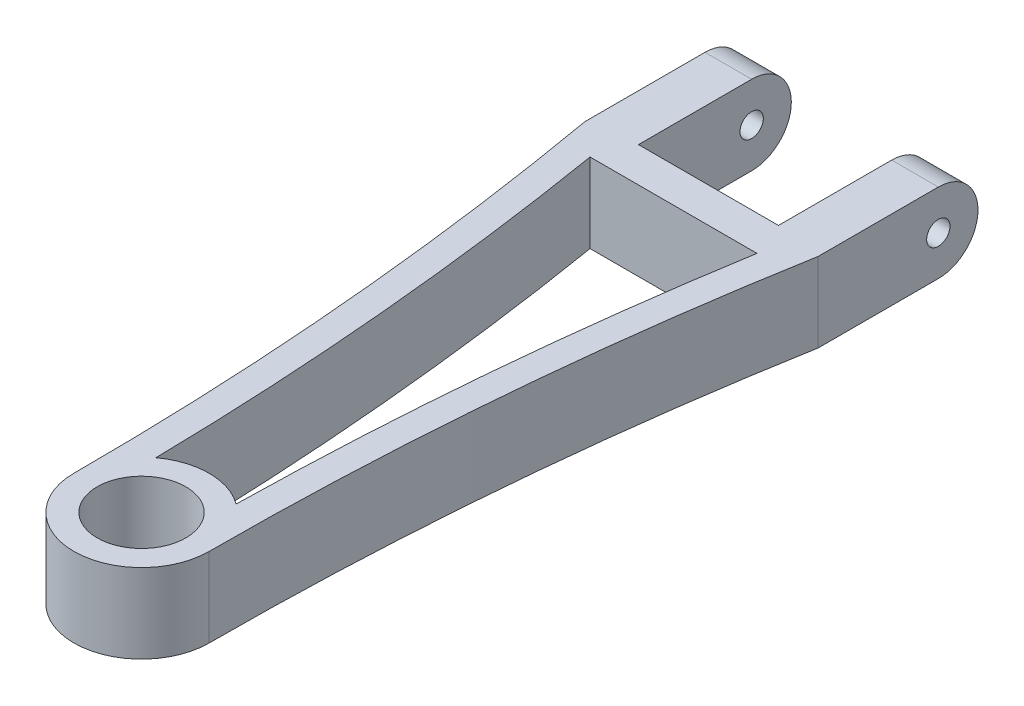
ISO-10303-21;
HEADER;
FILE_DESCRIPTION(('STEP AP214'),'2;1');
FILE_NAME('part.step','',(''),(''),'','','');
FILE_SCHEMA(('AUTOMOTIVE_DESIGN { 1 0 10303 214 1 1 1 1 }'));
ENDSEC;
DATA;
#1=APPLICATION_CONTEXT('core data for automotive mechanical design processes');
#2=APPLICATION_PROTOCOL_DEFINITION('international standard','automotive_design',2000,#1);
#3=PRODUCT_CONTEXT('',#1,'mechanical');
#4=PRODUCT('Part','Part','',(#3));
#5=PRODUCT_RELATED_PRODUCT_CATEGORY('part','',(#4));
#6=PRODUCT_DEFINITION_FORMATION('','',#4);
#7=PRODUCT_DEFINITION_CONTEXT('part definition',#1,'design');
#8=PRODUCT_DEFINITION('design','',#6,#7);
#9=PRODUCT_DEFINITION_SHAPE('','',#8);
#10=(LENGTH_UNIT() NAMED_UNIT(*) SI_UNIT(.MILLI.,.METRE.));
#11=(NAMED_UNIT(*) PLANE_ANGLE_UNIT() SI_UNIT($,.RADIAN.));
#12=(NAMED_UNIT(*) SI_UNIT($,.STERADIAN.) SOLID_ANGLE_UNIT());
#13=UNCERTAINTY_MEASURE_WITH_UNIT(LENGTH_MEASURE(1.E-05),#10,'distance_accuracy_value','');
#14=(GEOMETRIC_REPRESENTATION_CONTEXT(3) GLOBAL_UNCERTAINTY_ASSIGNED_CONTEXT((#13)) GLOBAL_UNIT_ASSIGNED_CONTEXT((#10,
#11,#12)) REPRESENTATION_CONTEXT('',''));
#15=CARTESIAN_POINT('',(0.,0.,0.));
#16=DIRECTION('',(0.,0.,1.));
#17=DIRECTION('',(1.,0.,0.));
#18=AXIS2_PLACEMENT_3D('',#15,#16,#17);
#19=CARTESIAN_POINT('',(895.939642857131,10.795,-1.02001740387436E-12));
#20=DIRECTION('',(0.,1.,0.));
#21=DIRECTION('',(0.,0.,1.));
#22=AXIS2_PLACEMENT_3D('',#19,#20,#21);
#23=PLANE('',#22);
#24=DIRECTION('',(1.,0.,0.));
#25=VECTOR('',#24,1.);
#26=CARTESIAN_POINT('',(-31.75,10.795,-185.094440122762));
#27=LINE('',#26,#25);
#28=CARTESIAN_POINT('',(-31.75,10.795,-185.094440122762));
#29=VERTEX_POINT('',#28);
#30=CARTESIAN_POINT('',(-19.0499999999999,10.795,-185.094440122762));
#31=VERTEX_POINT('',#30);
#32=EDGE_CURVE('E151',#29,#31,#27,.T.);
#33=ORIENTED_EDGE('',*,*,#32,.F.);
#34=DIRECTION('',(0.,0.,1.));
#35=VECTOR('',#34,1.);
#36=CARTESIAN_POINT('',(-31.75,10.795,-203.2));
#37=LINE('',#36,#35);
#38=CARTESIAN_POINT('',(-31.75,10.795,-152.4));
#39=VERTEX_POINT('',#38);
#40=EDGE_CURVE('E174',#29,#39,#37,.T.);
#41=ORIENTED_EDGE('',*,*,#40,.T.);
#42=CARTESIAN_POINT('',(-895.939642857131,10.795,-1.02001740387436E-12));
#43=DIRECTION('',(0.,-1.,0.));
#44=DIRECTION('',(0.,0.,-1.));
#45=AXIS2_PLACEMENT_3D('',#42,#43,#44);
#46=CIRCLE('',#45,877.524642857131);
#47=CARTESIAN_POINT('',(-18.415,10.795,0.));
#48=VERTEX_POINT('',#47);
#49=EDGE_CURVE('E194',#39,#48,#46,.T.);
#50=ORIENTED_EDGE('',*,*,#49,.T.);
#51=CARTESIAN_POINT('',(0.,10.795,0.));
#52=DIRECTION('',(0.,1.,0.));
#53=DIRECTION('',(0.,0.,1.));
#54=AXIS2_PLACEMENT_3D('',#51,#52,#53);
#55=CIRCLE('',#54,18.415);
#56=CARTESIAN_POINT('',(18.415,10.795,0.));
#57=VERTEX_POINT('',#56);
#58=EDGE_CURVE('E219',#48,#57,#55,.T.);
#59=ORIENTED_EDGE('',*,*,#58,.T.);
#60=CARTESIAN_POINT('',(895.939642857131,10.795,-1.02001740387436E-12));
#61=DIRECTION('',(0.,-1.,0.));
#62=DIRECTION('',(0.,0.,1.));
#63=AXIS2_PLACEMENT_3D('',#60,#61,#62);
#64=CIRCLE('',#63,877.524642857131);
#65=CARTESIAN_POINT('',(31.75,10.795,-152.4));
#66=VERTEX_POINT('',#65);
#67=EDGE_CURVE('E167',#57,#66,#64,.T.);
#68=ORIENTED_EDGE('',*,*,#67,.T.);
#69=DIRECTION('',(0.,0.,1.));
#70=VECTOR('',#69,1.);
#71=CARTESIAN_POINT('',(31.75,10.795,-203.2));
#72=LINE('',#71,#70);
#73=CARTESIAN_POINT('',(31.75,10.795,-185.094440122762));
#74=VERTEX_POINT('',#73);
#75=EDGE_CURVE('E158',#74,#66,#72,.T.);
#76=ORIENTED_EDGE('',*,*,#75,.F.);
#77=CARTESIAN_POINT('',(19.05,10.795,-185.094440122762));
#78=VERTEX_POINT('',#77);
#79=EDGE_CURVE('E140',#78,#74,#27,.T.);
#80=ORIENTED_EDGE('',*,*,#79,.F.);
#81=DIRECTION('',(0.,0.,1.));
#82=VECTOR('',#81,1.);
#83=CARTESIAN_POINT('',(19.05,10.795,-203.2));
#84=LINE('',#83,#82);
#85=CARTESIAN_POINT('',(19.05,10.795,-154.288880245525));
#86=VERTEX_POINT('',#85);
#87=EDGE_CURVE('E170',#78,#86,#84,.T.);
#88=ORIENTED_EDGE('',*,*,#87,.T.);
#89=DIRECTION('',(1.,0.,0.));
#90=VECTOR('',#89,1.);
#91=CARTESIAN_POINT('',(-31.751,10.795,-154.288880245525));
#92=LINE('',#91,#90);
#93=CARTESIAN_POINT('',(-19.05,10.795,-154.288880245525));
#94=VERTEX_POINT('',#93);
#95=EDGE_CURVE('E234',#94,#86,#92,.T.);
#96=ORIENTED_EDGE('',*,*,#95,.F.);
#97=DIRECTION('',(0.,0.,1.));
#98=VECTOR('',#97,1.);
#99=CARTESIAN_POINT('',(-19.05,10.795,-203.2));
#100=LINE('',#99,#98);
#101=EDGE_CURVE('E188',#31,#94,#100,.T.);
#102=ORIENTED_EDGE('',*,*,#101,.F.);
#103=EDGE_LOOP('',(#33,#41,#50,#59,#68,#76,#80,#88,#96,#102));
#104=FACE_BOUND('',#103,.T.);
#105=CARTESIAN_POINT('',(0.,10.795,0.));
#106=DIRECTION('',(0.,1.,0.));
#107=DIRECTION('',(0.,0.,1.));
#108=AXIS2_PLACEMENT_3D('',#105,#106,#107);
#109=CIRCLE('',#108,12.065);
#110=CARTESIAN_POINT('',(0.,10.795,12.065));
#111=VERTEX_POINT('',#110);
#112=EDGE_CURVE('E205',#111,#111,#109,.T.);
#113=ORIENTED_EDGE('',*,*,#112,.F.);
#114=EDGE_LOOP('',(#113));
#115=FACE_BOUND('',#114,.T.);
#116=CARTESIAN_POINT('',(0.,10.795,0.));
#117=DIRECTION('',(0.,-1.,0.));
#118=DIRECTION('',(0.,0.,-1.));
#119=AXIS2_PLACEMENT_3D('',#116,#117,#118);
#120=CIRCLE('',#119,18.4150000000032);
#121=CARTESIAN_POINT('',(-10.9192160684454,10.795,-14.8284505411295));
#122=VERTEX_POINT('',#121);
#123=CARTESIAN_POINT('',(10.9192160684454,10.795,-14.8284505411295));
#124=VERTEX_POINT('',#123);
#125=EDGE_CURVE('E282',#122,#124,#120,.T.);
#126=ORIENTED_EDGE('',*,*,#125,.F.);
#127=CARTESIAN_POINT('',(-895.939642857131,10.795,-1.02001740387436E-12));
#128=DIRECTION('',(0.,-1.,0.));
#129=DIRECTION('',(0.,0.,-1.));
#130=AXIS2_PLACEMENT_3D('',#127,#128,#129);
#131=CIRCLE('',#130,885.144642857131);
#132=CARTESIAN_POINT('',(-22.7158511641433,10.795,-144.78));
#133=VERTEX_POINT('',#132);
#134=EDGE_CURVE('E266',#133,#122,#131,.T.);
#135=ORIENTED_EDGE('',*,*,#134,.F.);
#136=DIRECTION('',(1.,0.,0.));
#137=VECTOR('',#136,1.);
#138=CARTESIAN_POINT('',(0.,10.795,-144.78));
#139=LINE('',#138,#137);
#140=CARTESIAN_POINT('',(22.7158511641433,10.795,-144.78));
#141=VERTEX_POINT('',#140);
#142=EDGE_CURVE('E386',#133,#141,#139,.T.);
#143=ORIENTED_EDGE('',*,*,#142,.T.);
#144=CARTESIAN_POINT('',(895.939642857131,10.795,-1.02001740387436E-12));
#145=DIRECTION('',(0.,-1.,0.));
#146=DIRECTION('',(0.,0.,-1.));
#147=AXIS2_PLACEMENT_3D('',#144,#145,#146);
#148=CIRCLE('',#147,885.144642857131);
#149=EDGE_CURVE('E275',#124,#141,#148,.T.);
#150=ORIENTED_EDGE('',*,*,#149,.F.);
#151=EDGE_LOOP('',(#126,#135,#143,#150));
#152=FACE_BOUND('',#151,.T.);
#153=ADVANCED_FACE('F38',(#104,#115,#152),#23,.T.);
#154=CARTESIAN_POINT('',(895.939642857131,-10.795,-1.02001740387436E-12));
#155=DIRECTION('',(0.,1.,0.));
#156=DIRECTION('',(0.,0.,1.));
#157=AXIS2_PLACEMENT_3D('',#154,#155,#156);
#158=PLANE('',#157);
#159=CARTESIAN_POINT('',(0.,-10.795,0.));
#160=DIRECTION('',(0.,1.,0.));
#161=DIRECTION('',(0.,0.,1.));
#162=AXIS2_PLACEMENT_3D('',#159,#160,#161);
#163=CIRCLE('',#162,12.065);
#164=CARTESIAN_POINT('',(0.,-10.795,12.065));
#165=VERTEX_POINT('',#164);
#166=EDGE_CURVE('E218',#165,#165,#163,.T.);
#167=ORIENTED_EDGE('',*,*,#166,.T.);
#168=EDGE_LOOP('',(#167));
#169=FACE_BOUND('',#168,.T.);
#170=DIRECTION('',(0.,0.,1.));
#171=VECTOR('',#170,1.);
#172=CARTESIAN_POINT('',(-31.75,-10.795,-203.2));
#173=LINE('',#172,#171);
#174=CARTESIAN_POINT('',(-31.75,-10.795,-185.094440122762));
#175=VERTEX_POINT('',#174);
#176=CARTESIAN_POINT('',(-31.75,-10.795,-152.4));
#177=VERTEX_POINT('',#176);
#178=EDGE_CURVE('E182',#175,#177,#173,.T.);
#179=ORIENTED_EDGE('',*,*,#178,.F.);
#180=DIRECTION('',(1.,0.,0.));
#181=VECTOR('',#180,1.);
#182=CARTESIAN_POINT('',(-31.75,-10.795,-185.094440122762));
#183=LINE('',#182,#181);
#184=CARTESIAN_POINT('',(-19.0500000000001,-10.795,-185.094440122762));
#185=VERTEX_POINT('',#184);
#186=EDGE_CURVE('E152',#175,#185,#183,.T.);
#187=ORIENTED_EDGE('',*,*,#186,.T.);
#188=DIRECTION('',(0.,0.,1.));
#189=VECTOR('',#188,1.);
#190=CARTESIAN_POINT('',(-19.0500000000001,-10.795,-203.2));
#191=LINE('',#190,#189);
#192=CARTESIAN_POINT('',(-19.0500000000001,-10.795,-152.4));
#193=VERTEX_POINT('',#192);
#194=EDGE_CURVE('E185',#185,#193,#191,.T.);
#195=ORIENTED_EDGE('',*,*,#194,.T.);
#196=DIRECTION('',(1.,0.,0.));
#197=VECTOR('',#196,1.);
#198=CARTESIAN_POINT('',(-31.751,-10.795,-152.4));
#199=LINE('',#198,#197);
#200=CARTESIAN_POINT('',(19.05,-10.795,-152.4));
#201=VERTEX_POINT('',#200);
#202=EDGE_CURVE('E226',#193,#201,#199,.T.);
#203=ORIENTED_EDGE('',*,*,#202,.T.);
#204=DIRECTION('',(0.,0.,1.));
#205=VECTOR('',#204,1.);
#206=CARTESIAN_POINT('',(19.05,-10.795,-203.2));
#207=LINE('',#206,#205);
#208=CARTESIAN_POINT('',(19.05,-10.795,-185.094440122762));
#209=VERTEX_POINT('',#208);
#210=EDGE_CURVE('E176',#209,#201,#207,.T.);
#211=ORIENTED_EDGE('',*,*,#210,.F.);
#212=CARTESIAN_POINT('',(31.75,-10.795,-185.094440122762));
#213=VERTEX_POINT('',#212);
#214=EDGE_CURVE('E287',#209,#213,#183,.T.);
#215=ORIENTED_EDGE('',*,*,#214,.T.);
#216=DIRECTION('',(0.,0.,1.));
#217=VECTOR('',#216,1.);
#218=CARTESIAN_POINT('',(31.75,-10.795,-203.2));
#219=LINE('',#218,#217);
#220=CARTESIAN_POINT('',(31.75,-10.795,-152.4));
#221=VERTEX_POINT('',#220);
#222=EDGE_CURVE('E160',#213,#221,#219,.T.);
#223=ORIENTED_EDGE('',*,*,#222,.T.);
#224=CARTESIAN_POINT('',(895.939642857131,-10.795,-1.02001740387436E-12));
#225=DIRECTION('',(0.,-1.,0.));
#226=DIRECTION('',(0.,0.,1.));
#227=AXIS2_PLACEMENT_3D('',#224,#225,#226);
#228=CIRCLE('',#227,877.524642857131);
#229=CARTESIAN_POINT('',(18.415,-10.795,0.));
#230=VERTEX_POINT('',#229);
#231=EDGE_CURVE('E210',#230,#221,#228,.T.);
#232=ORIENTED_EDGE('',*,*,#231,.F.);
#233=CARTESIAN_POINT('',(0.,-10.795,0.));
#234=DIRECTION('',(0.,1.,0.));
#235=DIRECTION('',(0.,0.,1.));
#236=AXIS2_PLACEMENT_3D('',#233,#234,#235);
#237=CIRCLE('',#236,18.415);
#238=CARTESIAN_POINT('',(-18.415,-10.795,0.));
#239=VERTEX_POINT('',#238);
#240=EDGE_CURVE('E199',#239,#230,#237,.T.);
#241=ORIENTED_EDGE('',*,*,#240,.F.);
#242=CARTESIAN_POINT('',(-895.939642857131,-10.795,-1.02001740387436E-12));
#243=DIRECTION('',(0.,-1.,0.));
#244=DIRECTION('',(0.,0.,-1.));
#245=AXIS2_PLACEMENT_3D('',#242,#243,#244);
#246=CIRCLE('',#245,877.524642857131);
#247=EDGE_CURVE('E200',#177,#239,#246,.T.);
#248=ORIENTED_EDGE('',*,*,#247,.F.);
#249=EDGE_LOOP('',(#179,#187,#195,#203,#211,#215,#223,#232,#241,#248));
#250=FACE_BOUND('',#249,.T.);
#251=CARTESIAN_POINT('',(-895.939642857131,-10.795,-1.02001740387436E-12));
#252=DIRECTION('',(0.,1.,0.));
#253=DIRECTION('',(0.,0.,1.));
#254=AXIS2_PLACEMENT_3D('',#251,#252,#253);
#255=CIRCLE('',#254,885.144642857131);
#256=CARTESIAN_POINT('',(-10.9192160684454,-10.795,-14.8284505411295));
#257=VERTEX_POINT('',#256);
#258=CARTESIAN_POINT('',(-22.7158511641433,-10.795,-144.78));
#259=VERTEX_POINT('',#258);
#260=EDGE_CURVE('E11',#257,#259,#255,.T.);
#261=ORIENTED_EDGE('',*,*,#260,.F.);
#262=CARTESIAN_POINT('',(0.,-10.795,0.));
#263=DIRECTION('',(0.,1.,0.));
#264=DIRECTION('',(0.,0.,1.));
#265=AXIS2_PLACEMENT_3D('',#262,#263,#264);
#266=CIRCLE('',#265,18.4150000000032);
#267=CARTESIAN_POINT('',(10.9192160684454,-10.795,-14.8284505411295));
#268=VERTEX_POINT('',#267);
#269=EDGE_CURVE('E49',#268,#257,#266,.T.);
#270=ORIENTED_EDGE('',*,*,#269,.F.);
#271=CARTESIAN_POINT('',(895.939642857131,-10.795,-1.02001740387436E-12));
#272=DIRECTION('',(0.,1.,0.));
#273=DIRECTION('',(0.,0.,1.));
#274=AXIS2_PLACEMENT_3D('',#271,#272,#273);
#275=CIRCLE('',#274,885.144642857131);
#276=CARTESIAN_POINT('',(22.7158511641433,-10.795,-144.78));
#277=VERTEX_POINT('',#276);
#278=EDGE_CURVE('E247',#277,#268,#275,.T.);
#279=ORIENTED_EDGE('',*,*,#278,.F.);
#280=DIRECTION('',(1.,0.,0.));
#281=VECTOR('',#280,1.);
#282=CARTESIAN_POINT('',(895.939642857131,-10.795,-144.78));
#283=LINE('',#282,#281);
#284=EDGE_CURVE('E42',#277,#259,#283,.F.);
#285=ORIENTED_EDGE('',*,*,#284,.T.);
#286=EDGE_LOOP('',(#261,#270,#279,#285));
#287=FACE_BOUND('',#286,.T.);
#288=ADVANCED_FACE('F270',(#169,#250,#287),#158,.F.);
#289=CARTESIAN_POINT('',(-19.05,1.31634899059417E-13,-203.2));
#290=DIRECTION('',(-1.,0.,0.));
#291=DIRECTION('',(0.,-1.,0.));
#292=AXIS2_PLACEMENT_3D('',#289,#290,#291);
#293=PLANE('',#292);
#294=CARTESIAN_POINT('',(-19.05,0.,-185.094440122762));
#295=DIRECTION('',(-1.,0.,0.));
#296=DIRECTION('',(0.,-1.,0.));
#297=AXIS2_PLACEMENT_3D('',#294,#295,#296);
#298=CIRCLE('',#297,3.175);
#299=CARTESIAN_POINT('',(-19.05,-3.175,-185.094440122762));
#300=VERTEX_POINT('',#299);
#301=EDGE_CURVE('E314',#300,#300,#298,.T.);
#302=ORIENTED_EDGE('',*,*,#301,.T.);
#303=EDGE_LOOP('',(#302));
#304=FACE_BOUND('',#303,.T.);
#305=CARTESIAN_POINT('',(-19.05,0.,-185.094440122762));
#306=DIRECTION('',(-1.,0.,0.));
#307=DIRECTION('',(0.,-1.,0.));
#308=AXIS2_PLACEMENT_3D('',#305,#306,#307);
#309=CIRCLE('',#308,10.795);
#310=EDGE_CURVE('E299',#31,#185,#309,.T.);
#311=ORIENTED_EDGE('',*,*,#310,.F.);
#312=ORIENTED_EDGE('',*,*,#101,.T.);
#313=DIRECTION('',(0.,0.996194698091746,-0.0871557427476516));
#314=VECTOR('',#313,1.);
#315=CARTESIAN_POINT('',(-19.05,-10.795,-152.4));
#316=LINE('',#315,#314);
#317=EDGE_CURVE('E233',#193,#94,#316,.T.);
#318=ORIENTED_EDGE('',*,*,#317,.F.);
#319=ORIENTED_EDGE('',*,*,#194,.F.);
#320=EDGE_LOOP('',(#311,#312,#318,#319));
#321=FACE_BOUND('',#320,.T.);
#322=ADVANCED_FACE('F331',(#304,#321),#293,.F.);
#323=CARTESIAN_POINT('',(-31.75,0.,-203.2));
#324=DIRECTION('',(1.,0.,0.));
#325=DIRECTION('',(0.,0.,-1.));
#326=AXIS2_PLACEMENT_3D('',#323,#324,#325);
#327=PLANE('',#326);
#328=CARTESIAN_POINT('',(-31.75,0.,-185.094440122762));
#329=DIRECTION('',(1.,0.,0.));
#330=DIRECTION('',(0.,0.,-1.));
#331=AXIS2_PLACEMENT_3D('',#328,#329,#330);
#332=CIRCLE('',#331,3.175);
#333=CARTESIAN_POINT('',(-31.75,0.,-188.269440122762));
#334=VERTEX_POINT('',#333);
#335=EDGE_CURVE('E306',#334,#334,#332,.T.);
#336=ORIENTED_EDGE('',*,*,#335,.T.);
#337=EDGE_LOOP('',(#336));
#338=FACE_BOUND('',#337,.T.);
#339=CARTESIAN_POINT('',(-31.75,0.,-185.094440122762));
#340=DIRECTION('',(1.,0.,0.));
#341=DIRECTION('',(0.,0.,-1.));
#342=AXIS2_PLACEMENT_3D('',#339,#340,#341);
#343=CIRCLE('',#342,10.795);
#344=EDGE_CURVE('E268',#175,#29,#343,.T.);
#345=ORIENTED_EDGE('',*,*,#344,.F.);
#346=ORIENTED_EDGE('',*,*,#178,.T.);
#347=DIRECTION('',(0.,-1.,0.));
#348=VECTOR('',#347,1.);
#349=CARTESIAN_POINT('',(-31.75,10.795,-152.4));
#350=LINE('',#349,#348);
#351=EDGE_CURVE('E195',#39,#177,#350,.T.);
#352=ORIENTED_EDGE('',*,*,#351,.F.);
#353=ORIENTED_EDGE('',*,*,#40,.F.);
#354=EDGE_LOOP('',(#345,#346,#352,#353));
#355=FACE_BOUND('',#354,.T.);
#356=ADVANCED_FACE('F338',(#338,#355),#327,.F.);
#357=CARTESIAN_POINT('',(19.05,0.,-203.2));
#358=DIRECTION('',(-1.,0.,0.));
#359=DIRECTION('',(0.,-1.,0.));
#360=AXIS2_PLACEMENT_3D('',#357,#358,#359);
#361=PLANE('',#360);
#362=CARTESIAN_POINT('',(19.05,0.,-185.094440122762));
#363=DIRECTION('',(-1.,0.,0.));
#364=DIRECTION('',(0.,-1.,0.));
#365=AXIS2_PLACEMENT_3D('',#362,#363,#364);
#366=CIRCLE('',#365,3.175);
#367=CARTESIAN_POINT('',(19.05,-3.175,-185.094440122762));
#368=VERTEX_POINT('',#367);
#369=EDGE_CURVE('E310',#368,#368,#366,.T.);
#370=ORIENTED_EDGE('',*,*,#369,.F.);
#371=EDGE_LOOP('',(#370));
#372=FACE_BOUND('',#371,.T.);
#373=ORIENTED_EDGE('',*,*,#87,.F.);
#374=CARTESIAN_POINT('',(19.05,0.,-185.094440122762));
#375=DIRECTION('',(-1.,0.,0.));
#376=DIRECTION('',(0.,-1.,0.));
#377=AXIS2_PLACEMENT_3D('',#374,#375,#376);
#378=CIRCLE('',#377,10.795);
#379=EDGE_CURVE('E146',#78,#209,#378,.T.);
#380=ORIENTED_EDGE('',*,*,#379,.T.);
#381=ORIENTED_EDGE('',*,*,#210,.T.);
#382=DIRECTION('',(0.,-0.996194698091746,0.0871557427476516));
#383=VECTOR('',#382,1.);
#384=CARTESIAN_POINT('',(19.05,-10.795,-152.4));
#385=LINE('',#384,#383);
#386=EDGE_CURVE('E162',#86,#201,#385,.T.);
#387=ORIENTED_EDGE('',*,*,#386,.F.);
#388=EDGE_LOOP('',(#373,#380,#381,#387));
#389=FACE_BOUND('',#388,.T.);
#390=ADVANCED_FACE('F321',(#372,#389),#361,.T.);
#391=CARTESIAN_POINT('',(31.75,0.,-203.2));
#392=DIRECTION('',(-1.,0.,0.));
#393=DIRECTION('',(0.,0.,1.));
#394=AXIS2_PLACEMENT_3D('',#391,#392,#393);
#395=PLANE('',#394);
#396=CARTESIAN_POINT('',(31.75,0.,-185.094440122762));
#397=DIRECTION('',(1.,0.,0.));
#398=DIRECTION('',(0.,0.,-1.));
#399=AXIS2_PLACEMENT_3D('',#396,#397,#398);
#400=CIRCLE('',#399,3.175);
#401=CARTESIAN_POINT('',(31.75,0.,-188.269440122762));
#402=VERTEX_POINT('',#401);
#403=EDGE_CURVE('E302',#402,#402,#400,.T.);
#404=ORIENTED_EDGE('',*,*,#403,.F.);
#405=EDGE_LOOP('',(#404));
#406=FACE_BOUND('',#405,.T.);
#407=CARTESIAN_POINT('',(31.75,0.,-185.094440122762));
#408=DIRECTION('',(1.,0.,0.));
#409=DIRECTION('',(0.,0.,-1.));
#410=AXIS2_PLACEMENT_3D('',#407,#408,#409);
#411=CIRCLE('',#410,10.795);
#412=EDGE_CURVE('E143',#74,#213,#411,.F.);
#413=ORIENTED_EDGE('',*,*,#412,.F.);
#414=ORIENTED_EDGE('',*,*,#75,.T.);
#415=DIRECTION('',(0.,-1.,0.));
#416=VECTOR('',#415,1.);
#417=CARTESIAN_POINT('',(31.75,10.795,-152.4));
#418=LINE('',#417,#416);
#419=EDGE_CURVE('E191',#66,#221,#418,.T.);
#420=ORIENTED_EDGE('',*,*,#419,.T.);
#421=ORIENTED_EDGE('',*,*,#222,.F.);
#422=EDGE_LOOP('',(#413,#414,#420,#421));
#423=FACE_BOUND('',#422,.T.);
#424=ADVANCED_FACE('F156',(#406,#423),#395,.F.);
#425=CARTESIAN_POINT('',(895.939642857131,10.795,-1.02001740387436E-12));
#426=DIRECTION('',(0.,-1.,0.));
#427=DIRECTION('',(0.,0.,-1.));
#428=AXIS2_PLACEMENT_3D('',#425,#426,#427);
#429=CYLINDRICAL_SURFACE('',#428,877.524642857131);
#430=ORIENTED_EDGE('',*,*,#231,.T.);
#431=ORIENTED_EDGE('',*,*,#419,.F.);
#432=ORIENTED_EDGE('',*,*,#67,.F.);
#433=DIRECTION('',(0.,-1.,0.));
#434=VECTOR('',#433,1.);
#435=CARTESIAN_POINT('',(18.415,10.795,0.));
#436=LINE('',#435,#434);
#437=EDGE_CURVE('E206',#57,#230,#436,.T.);
#438=ORIENTED_EDGE('',*,*,#437,.T.);
#439=EDGE_LOOP('',(#430,#431,#432,#438));
#440=FACE_BOUND('',#439,.T.);
#441=ADVANCED_FACE('F351',(#440),#429,.F.);
#442=CARTESIAN_POINT('',(-895.939642857131,10.795,-1.02001740387436E-12));
#443=DIRECTION('',(0.,-1.,0.));
#444=DIRECTION('',(0.,0.,-1.));
#445=AXIS2_PLACEMENT_3D('',#442,#443,#444);
#446=CYLINDRICAL_SURFACE('',#445,877.524642857131);
#447=ORIENTED_EDGE('',*,*,#247,.T.);
#448=DIRECTION('',(0.,-1.,0.));
#449=VECTOR('',#448,1.);
#450=CARTESIAN_POINT('',(-18.415,10.795,0.));
#451=LINE('',#450,#449);
#452=EDGE_CURVE('E201',#48,#239,#451,.T.);
#453=ORIENTED_EDGE('',*,*,#452,.F.);
#454=ORIENTED_EDGE('',*,*,#49,.F.);
#455=ORIENTED_EDGE('',*,*,#351,.T.);
#456=EDGE_LOOP('',(#447,#453,#454,#455));
#457=FACE_BOUND('',#456,.T.);
#458=ADVANCED_FACE('F343',(#457),#446,.F.);
#459=CARTESIAN_POINT('',(0.,10.795,0.));
#460=DIRECTION('',(0.,-1.,0.));
#461=DIRECTION('',(0.,0.,-1.));
#462=AXIS2_PLACEMENT_3D('',#459,#460,#461);
#463=CYLINDRICAL_SURFACE('',#462,18.415);
#464=ORIENTED_EDGE('',*,*,#240,.T.);
#465=ORIENTED_EDGE('',*,*,#437,.F.);
#466=ORIENTED_EDGE('',*,*,#58,.F.);
#467=ORIENTED_EDGE('',*,*,#452,.T.);
#468=EDGE_LOOP('',(#464,#465,#466,#467));
#469=FACE_BOUND('',#468,.T.);
#470=ADVANCED_FACE('F347',(#469),#463,.T.);
#471=CARTESIAN_POINT('',(0.,10.795,0.));
#472=DIRECTION('',(0.,-1.,0.));
#473=DIRECTION('',(0.,0.,-1.));
#474=AXIS2_PLACEMENT_3D('',#471,#472,#473);
#475=CYLINDRICAL_SURFACE('',#474,12.065);
#476=ORIENTED_EDGE('',*,*,#112,.T.);
#477=EDGE_LOOP('',(#476));
#478=FACE_BOUND('',#477,.T.);
#479=ORIENTED_EDGE('',*,*,#166,.F.);
#480=EDGE_LOOP('',(#479));
#481=FACE_BOUND('',#480,.T.);
#482=ADVANCED_FACE('F371',(#478,#481),#475,.F.);
#483=CARTESIAN_POINT('',(-31.751,-10.795,-152.4));
#484=DIRECTION('',(0.,0.0871557427476516,0.996194698091746));
#485=DIRECTION('',(0.,-0.996194698091746,0.0871557427476516));
#486=AXIS2_PLACEMENT_3D('',#483,#484,#485);
#487=PLANE('',#486);
#488=ORIENTED_EDGE('',*,*,#317,.T.);
#489=ORIENTED_EDGE('',*,*,#95,.T.);
#490=ORIENTED_EDGE('',*,*,#386,.T.);
#491=ORIENTED_EDGE('',*,*,#202,.F.);
#492=EDGE_LOOP('',(#488,#489,#490,#491));
#493=FACE_BOUND('',#492,.T.);
#494=ADVANCED_FACE('F40',(#493),#487,.F.);
#495=CARTESIAN_POINT('',(-31.75,0.,-185.094440122762));
#496=DIRECTION('',(1.,0.,0.));
#497=DIRECTION('',(0.,0.,-1.));
#498=AXIS2_PLACEMENT_3D('',#495,#496,#497);
#499=CYLINDRICAL_SURFACE('',#498,3.175);
#500=ORIENTED_EDGE('',*,*,#369,.T.);
#501=EDGE_LOOP('',(#500));
#502=FACE_BOUND('',#501,.T.);
#503=ORIENTED_EDGE('',*,*,#403,.T.);
#504=EDGE_LOOP('',(#503));
#505=FACE_BOUND('',#504,.T.);
#506=ADVANCED_FACE('F378',(#502,#505),#499,.F.);
#507=ORIENTED_EDGE('',*,*,#335,.F.);
#508=EDGE_LOOP('',(#507));
#509=FACE_BOUND('',#508,.T.);
#510=ORIENTED_EDGE('',*,*,#301,.F.);
#511=EDGE_LOOP('',(#510));
#512=FACE_BOUND('',#511,.T.);
#513=ADVANCED_FACE('F407',(#509,#512),#499,.F.);
#514=CARTESIAN_POINT('',(-31.75,0.,-185.094440122762));
#515=DIRECTION('',(1.,0.,0.));
#516=DIRECTION('',(0.,0.,-1.));
#517=AXIS2_PLACEMENT_3D('',#514,#515,#516);
#518=CYLINDRICAL_SURFACE('',#517,10.795);
#519=ORIENTED_EDGE('',*,*,#79,.T.);
#520=ORIENTED_EDGE('',*,*,#412,.T.);
#521=ORIENTED_EDGE('',*,*,#214,.F.);
#522=ORIENTED_EDGE('',*,*,#379,.F.);
#523=EDGE_LOOP('',(#519,#520,#521,#522));
#524=FACE_BOUND('',#523,.T.);
#525=ADVANCED_FACE('F142',(#524),#518,.T.);
#526=ORIENTED_EDGE('',*,*,#310,.T.);
#527=ORIENTED_EDGE('',*,*,#186,.F.);
#528=ORIENTED_EDGE('',*,*,#344,.T.);
#529=ORIENTED_EDGE('',*,*,#32,.T.);
#530=EDGE_LOOP('',(#526,#527,#528,#529));
#531=FACE_BOUND('',#530,.T.);
#532=ADVANCED_FACE('F403',(#531),#518,.T.);
#533=CARTESIAN_POINT('',(-895.939642857131,10.795,-1.02001740387436E-12));
#534=DIRECTION('',(0.,-1.,0.));
#535=DIRECTION('',(0.,0.,-1.));
#536=AXIS2_PLACEMENT_3D('',#533,#534,#535);
#537=CYLINDRICAL_SURFACE('',#536,885.144642857131);
#538=ORIENTED_EDGE('',*,*,#260,.T.);
#539=DIRECTION('',(0.,-1.,0.));
#540=VECTOR('',#539,1.);
#541=CARTESIAN_POINT('',(-22.7158511641433,10.795,-144.78));
#542=LINE('',#541,#540);
#543=EDGE_CURVE('E71',#133,#259,#542,.T.);
#544=ORIENTED_EDGE('',*,*,#543,.F.);
#545=ORIENTED_EDGE('',*,*,#134,.T.);
#546=DIRECTION('',(0.,-1.,0.));
#547=VECTOR('',#546,1.);
#548=CARTESIAN_POINT('',(-10.9192160684454,10.795,-14.8284505411295));
#549=LINE('',#548,#547);
#550=EDGE_CURVE('E257',#122,#257,#549,.T.);
#551=ORIENTED_EDGE('',*,*,#550,.T.);
#552=EDGE_LOOP('',(#538,#544,#545,#551));
#553=FACE_BOUND('',#552,.T.);
#554=ADVANCED_FACE('F264',(#553),#537,.T.);
#555=CARTESIAN_POINT('',(0.,10.795,0.));
#556=DIRECTION('',(0.,-1.,0.));
#557=DIRECTION('',(0.,0.,-1.));
#558=AXIS2_PLACEMENT_3D('',#555,#556,#557);
#559=CYLINDRICAL_SURFACE('',#558,18.4150000000032);
#560=ORIENTED_EDGE('',*,*,#269,.T.);
#561=ORIENTED_EDGE('',*,*,#550,.F.);
#562=ORIENTED_EDGE('',*,*,#125,.T.);
#563=DIRECTION('',(0.,-1.,0.));
#564=VECTOR('',#563,1.);
#565=CARTESIAN_POINT('',(10.9192160684454,10.795,-14.8284505411295));
#566=LINE('',#565,#564);
#567=EDGE_CURVE('E260',#124,#268,#566,.T.);
#568=ORIENTED_EDGE('',*,*,#567,.T.);
#569=EDGE_LOOP('',(#560,#561,#562,#568));
#570=FACE_BOUND('',#569,.T.);
#571=ADVANCED_FACE('F256',(#570),#559,.T.);
#572=CARTESIAN_POINT('',(895.939642857131,10.795,-1.02001740387436E-12));
#573=DIRECTION('',(0.,-1.,0.));
#574=DIRECTION('',(0.,0.,-1.));
#575=AXIS2_PLACEMENT_3D('',#572,#573,#574);
#576=CYLINDRICAL_SURFACE('',#575,885.144642857131);
#577=ORIENTED_EDGE('',*,*,#278,.T.);
#578=ORIENTED_EDGE('',*,*,#567,.F.);
#579=ORIENTED_EDGE('',*,*,#149,.T.);
#580=DIRECTION('',(0.,-1.,0.));
#581=VECTOR('',#580,1.);
#582=CARTESIAN_POINT('',(22.7158511641433,10.795,-144.78));
#583=LINE('',#582,#581);
#584=EDGE_CURVE('E56',#141,#277,#583,.T.);
#585=ORIENTED_EDGE('',*,*,#584,.T.);
#586=EDGE_LOOP('',(#577,#578,#579,#585));
#587=FACE_BOUND('',#586,.T.);
#588=ADVANCED_FACE('F273',(#587),#576,.T.);
#589=CARTESIAN_POINT('',(0.,10.795,-144.78));
#590=DIRECTION('',(0.,0.,-1.));
#591=DIRECTION('',(-1.,0.,0.));
#592=AXIS2_PLACEMENT_3D('',#589,#590,#591);
#593=PLANE('',#592);
#594=ORIENTED_EDGE('',*,*,#584,.F.);
#595=ORIENTED_EDGE('',*,*,#142,.F.);
#596=ORIENTED_EDGE('',*,*,#543,.T.);
#597=ORIENTED_EDGE('',*,*,#284,.F.);
#598=EDGE_LOOP('',(#594,#595,#596,#597));
#599=FACE_BOUND('',#598,.T.);
#600=ADVANCED_FACE('F392',(#599),#593,.F.);
#601=CLOSED_SHELL('',(#153,#288,#322,#356,#390,#424,#441,#458,#470,#482,#494,#506,#513,#525,
#532,#554,#571,#588,#600));
#602=MANIFOLD_SOLID_BREP('B2',#601);
#603=ADVANCED_BREP_SHAPE_REPRESENTATION('',(#18,#602),#14);
#604=SHAPE_DEFINITION_REPRESENTATION(#9,#603);
ENDSEC;
END-ISO-10303-21;
